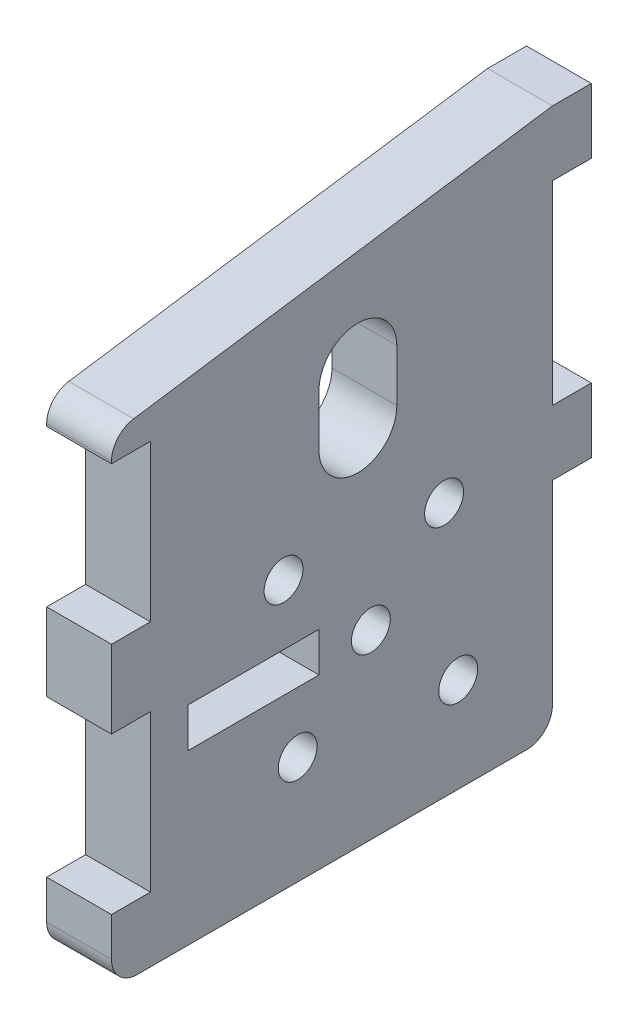
ISO-10303-21;
HEADER;
FILE_DESCRIPTION(('STEP AP214'),'2;1');
FILE_NAME('part.step','',(''),(''),'','','');
FILE_SCHEMA(('AUTOMOTIVE_DESIGN { 1 0 10303 214 1 1 1 1 }'));
ENDSEC;
DATA;
#1=APPLICATION_CONTEXT('core data for automotive mechanical design processes');
#2=APPLICATION_PROTOCOL_DEFINITION('international standard','automotive_design',2000,#1);
#3=PRODUCT_CONTEXT('',#1,'mechanical');
#4=PRODUCT('Part','Part','',(#3));
#5=PRODUCT_RELATED_PRODUCT_CATEGORY('part','',(#4));
#6=PRODUCT_DEFINITION_FORMATION('','',#4);
#7=PRODUCT_DEFINITION_CONTEXT('part definition',#1,'design');
#8=PRODUCT_DEFINITION('design','',#6,#7);
#9=PRODUCT_DEFINITION_SHAPE('','',#8);
#10=(LENGTH_UNIT() NAMED_UNIT(*) SI_UNIT(.MILLI.,.METRE.));
#11=(NAMED_UNIT(*) PLANE_ANGLE_UNIT() SI_UNIT($,.RADIAN.));
#12=(NAMED_UNIT(*) SI_UNIT($,.STERADIAN.) SOLID_ANGLE_UNIT());
#13=UNCERTAINTY_MEASURE_WITH_UNIT(LENGTH_MEASURE(1.E-05),#10,'distance_accuracy_value','');
#14=(GEOMETRIC_REPRESENTATION_CONTEXT(3) GLOBAL_UNCERTAINTY_ASSIGNED_CONTEXT((#13)) GLOBAL_UNIT_ASSIGNED_CONTEXT((#10,
#11,#12)) REPRESENTATION_CONTEXT('',''));
#15=CARTESIAN_POINT('',(0.,0.,0.));
#16=DIRECTION('',(0.,0.,1.));
#17=DIRECTION('',(1.,0.,0.));
#18=AXIS2_PLACEMENT_3D('',#15,#16,#17);
#19=CARTESIAN_POINT('',(5.,23.,20.));
#20=DIRECTION('',(0.,0.,-1.));
#21=DIRECTION('',(0.,1.,0.));
#22=AXIS2_PLACEMENT_3D('',#19,#20,#21);
#23=PLANE('',#22);
#24=DIRECTION('',(0.,-1.,0.));
#25=VECTOR('',#24,1.);
#26=CARTESIAN_POINT('',(0.,23.,20.));
#27=LINE('',#26,#25);
#28=CARTESIAN_POINT('',(0.,-9.00000000000001,20.));
#29=VERTEX_POINT('',#28);
#30=CARTESIAN_POINT('',(0.,-12.,20.));
#31=VERTEX_POINT('',#30);
#32=EDGE_CURVE('E411',#29,#31,#27,.T.);
#33=ORIENTED_EDGE('',*,*,#32,.T.);
#34=DIRECTION('',(-1.,0.,0.));
#35=VECTOR('',#34,1.);
#36=CARTESIAN_POINT('',(5.,-12.,20.));
#37=LINE('',#36,#35);
#38=CARTESIAN_POINT('',(5.,-12.,20.));
#39=VERTEX_POINT('',#38);
#40=EDGE_CURVE('E11',#31,#39,#37,.F.);
#41=ORIENTED_EDGE('',*,*,#40,.T.);
#42=DIRECTION('',(0.,-1.,0.));
#43=VECTOR('',#42,1.);
#44=CARTESIAN_POINT('',(5.,23.,20.));
#45=LINE('',#44,#43);
#46=CARTESIAN_POINT('',(5.,-9.00000000000001,20.));
#47=VERTEX_POINT('',#46);
#48=EDGE_CURVE('E385',#47,#39,#45,.T.);
#49=ORIENTED_EDGE('',*,*,#48,.F.);
#50=DIRECTION('',(1.,0.,0.));
#51=VECTOR('',#50,1.);
#52=CARTESIAN_POINT('',(0.,-9.00000000000001,20.));
#53=LINE('',#52,#51);
#54=EDGE_CURVE('E284',#29,#47,#53,.T.);
#55=ORIENTED_EDGE('',*,*,#54,.F.);
#56=EDGE_LOOP('',(#33,#41,#49,#55));
#57=FACE_BOUND('',#56,.T.);
#58=ADVANCED_FACE('F33',(#57),#23,.F.);
#59=CARTESIAN_POINT('',(5.,21.2726070261836,20.));
#60=VERTEX_POINT('',#59);
#61=CARTESIAN_POINT('',(5.,21.1,20.));
#62=VERTEX_POINT('',#61);
#63=EDGE_CURVE('E386',#60,#62,#45,.T.);
#64=ORIENTED_EDGE('',*,*,#63,.F.);
#65=DIRECTION('',(-1.,0.,0.));
#66=VECTOR('',#65,1.);
#67=CARTESIAN_POINT('',(5.,21.2726070261836,20.));
#68=LINE('',#67,#66);
#69=CARTESIAN_POINT('',(0.,21.2726070261836,20.));
#70=VERTEX_POINT('',#69);
#71=EDGE_CURVE('E482',#60,#70,#68,.T.);
#72=ORIENTED_EDGE('',*,*,#71,.T.);
#73=CARTESIAN_POINT('',(0.,21.1,20.));
#74=VERTEX_POINT('',#73);
#75=EDGE_CURVE('E412',#70,#74,#27,.T.);
#76=ORIENTED_EDGE('',*,*,#75,.T.);
#77=DIRECTION('',(1.,0.,0.));
#78=VECTOR('',#77,1.);
#79=CARTESIAN_POINT('',(0.,21.1,20.));
#80=LINE('',#79,#78);
#81=EDGE_CURVE('E308',#74,#62,#80,.T.);
#82=ORIENTED_EDGE('',*,*,#81,.T.);
#83=EDGE_LOOP('',(#64,#72,#76,#82));
#84=FACE_BOUND('',#83,.T.);
#85=ADVANCED_FACE('F487',(#84),#23,.F.);
#86=CARTESIAN_POINT('',(5.,0.,0.));
#87=DIRECTION('',(1.,0.,0.));
#88=DIRECTION('',(0.,0.,-1.));
#89=AXIS2_PLACEMENT_3D('',#86,#87,#88);
#90=PLANE('',#89);
#91=CARTESIAN_POINT('',(5.,18.,1.));
#92=DIRECTION('',(1.,0.,0.));
#93=DIRECTION('',(0.,0.,1.));
#94=AXIS2_PLACEMENT_3D('',#91,#92,#93);
#95=CIRCLE('',#94,3.);
#96=CARTESIAN_POINT('',(5.,18.,-2.));
#97=VERTEX_POINT('',#96);
#98=CARTESIAN_POINT('',(5.,18.,4.));
#99=VERTEX_POINT('',#98);
#100=EDGE_CURVE('E250',#97,#99,#95,.T.);
#101=ORIENTED_EDGE('',*,*,#100,.F.);
#102=DIRECTION('',(0.,1.,0.));
#103=VECTOR('',#102,1.);
#104=CARTESIAN_POINT('',(5.,18.,-2.));
#105=LINE('',#104,#103);
#106=CARTESIAN_POINT('',(5.,14.,-2.));
#107=VERTEX_POINT('',#106);
#108=EDGE_CURVE('E254',#107,#97,#105,.T.);
#109=ORIENTED_EDGE('',*,*,#108,.F.);
#110=CARTESIAN_POINT('',(5.,14.,1.));
#111=DIRECTION('',(1.,0.,0.));
#112=DIRECTION('',(0.,0.,-1.));
#113=AXIS2_PLACEMENT_3D('',#110,#111,#112);
#114=CIRCLE('',#113,3.);
#115=CARTESIAN_POINT('',(5.,14.,4.));
#116=VERTEX_POINT('',#115);
#117=EDGE_CURVE('E234',#116,#107,#114,.T.);
#118=ORIENTED_EDGE('',*,*,#117,.F.);
#119=DIRECTION('',(0.,-1.,0.));
#120=VECTOR('',#119,1.);
#121=CARTESIAN_POINT('',(5.,18.,4.));
#122=LINE('',#121,#120);
#123=EDGE_CURVE('E245',#99,#116,#122,.T.);
#124=ORIENTED_EDGE('',*,*,#123,.F.);
#125=EDGE_LOOP('',(#101,#109,#118,#124));
#126=FACE_BOUND('',#125,.T.);
#127=DIRECTION('',(0.,0.,-1.));
#128=VECTOR('',#127,1.);
#129=CARTESIAN_POINT('',(5.,-14.,-14.));
#130=LINE('',#129,#128);
#131=CARTESIAN_POINT('',(5.,-14.,18.));
#132=VERTEX_POINT('',#131);
#133=CARTESIAN_POINT('',(5.,-14.,-12.));
#134=VERTEX_POINT('',#133);
#135=EDGE_CURVE('E388',#132,#134,#130,.T.);
#136=ORIENTED_EDGE('',*,*,#135,.T.);
#137=CARTESIAN_POINT('',(5.,-12.,-12.));
#138=DIRECTION('',(1.,0.,0.));
#139=DIRECTION('',(0.,0.,-1.));
#140=AXIS2_PLACEMENT_3D('',#137,#138,#139);
#141=CIRCLE('',#140,2.);
#142=CARTESIAN_POINT('',(5.,-12.,-14.));
#143=VERTEX_POINT('',#142);
#144=EDGE_CURVE('E480',#134,#143,#141,.T.);
#145=ORIENTED_EDGE('',*,*,#144,.T.);
#146=DIRECTION('',(0.,1.,0.));
#147=VECTOR('',#146,1.);
#148=CARTESIAN_POINT('',(5.,3.,-14.));
#149=LINE('',#148,#147);
#150=CARTESIAN_POINT('',(5.,3.,-14.));
#151=VERTEX_POINT('',#150);
#152=EDGE_CURVE('E392',#143,#151,#149,.T.);
#153=ORIENTED_EDGE('',*,*,#152,.T.);
#154=DIRECTION('',(0.,0.,-1.));
#155=VECTOR('',#154,1.);
#156=CARTESIAN_POINT('',(5.,3.,-17.));
#157=LINE('',#156,#155);
#158=CARTESIAN_POINT('',(5.,3.,-17.));
#159=VERTEX_POINT('',#158);
#160=EDGE_CURVE('E394',#151,#159,#157,.T.);
#161=ORIENTED_EDGE('',*,*,#160,.T.);
#162=DIRECTION('',(0.,1.,0.));
#163=VECTOR('',#162,1.);
#164=CARTESIAN_POINT('',(5.,8.00000000000001,-17.));
#165=LINE('',#164,#163);
#166=CARTESIAN_POINT('',(5.,8.00000000000001,-17.));
#167=VERTEX_POINT('',#166);
#168=EDGE_CURVE('E396',#159,#167,#165,.T.);
#169=ORIENTED_EDGE('',*,*,#168,.T.);
#170=DIRECTION('',(0.,0.,1.));
#171=VECTOR('',#170,1.);
#172=CARTESIAN_POINT('',(5.,8.00000000000001,-14.));
#173=LINE('',#172,#171);
#174=CARTESIAN_POINT('',(5.,8.00000000000001,-14.));
#175=VERTEX_POINT('',#174);
#176=EDGE_CURVE('E398',#167,#175,#173,.T.);
#177=ORIENTED_EDGE('',*,*,#176,.T.);
#178=DIRECTION('',(0.,1.,0.));
#179=VECTOR('',#178,1.);
#180=CARTESIAN_POINT('',(5.,23.,-14.));
#181=LINE('',#180,#179);
#182=CARTESIAN_POINT('',(5.,23.,-14.));
#183=VERTEX_POINT('',#182);
#184=EDGE_CURVE('E400',#175,#183,#181,.T.);
#185=ORIENTED_EDGE('',*,*,#184,.T.);
#186=DIRECTION('',(0.,0.,-1.));
#187=VECTOR('',#186,1.);
#188=CARTESIAN_POINT('',(5.,23.,-17.));
#189=LINE('',#188,#187);
#190=CARTESIAN_POINT('',(5.,23.,-17.));
#191=VERTEX_POINT('',#190);
#192=EDGE_CURVE('E402',#183,#191,#189,.T.);
#193=ORIENTED_EDGE('',*,*,#192,.T.);
#194=DIRECTION('',(0.,1.,0.));
#195=VECTOR('',#194,1.);
#196=CARTESIAN_POINT('',(5.,28.,-17.));
#197=LINE('',#196,#195);
#198=CARTESIAN_POINT('',(5.,28.,-17.));
#199=VERTEX_POINT('',#198);
#200=EDGE_CURVE('E404',#191,#199,#197,.T.);
#201=ORIENTED_EDGE('',*,*,#200,.T.);
#202=DIRECTION('',(0.,0.,1.));
#203=VECTOR('',#202,1.);
#204=CARTESIAN_POINT('',(5.,28.,-17.));
#205=LINE('',#204,#203);
#206=CARTESIAN_POINT('',(5.,28.,-14.));
#207=VERTEX_POINT('',#206);
#208=EDGE_CURVE('E379',#199,#207,#205,.T.);
#209=ORIENTED_EDGE('',*,*,#208,.T.);
#210=DIRECTION('',(0.,-0.145493990494831,0.989359135364853));
#211=VECTOR('',#210,1.);
#212=CARTESIAN_POINT('',(5.,28.,-14.));
#213=LINE('',#212,#211);
#214=CARTESIAN_POINT('',(5.,23.2513252969133,18.2909879809897));
#215=VERTEX_POINT('',#214);
#216=EDGE_CURVE('E382',#207,#215,#213,.T.);
#217=ORIENTED_EDGE('',*,*,#216,.T.);
#218=CARTESIAN_POINT('',(5.,21.2726070261836,18.));
#219=DIRECTION('',(1.,0.,0.));
#220=DIRECTION('',(0.,0.,-1.));
#221=AXIS2_PLACEMENT_3D('',#218,#219,#220);
#222=CIRCLE('',#221,2.);
#223=EDGE_CURVE('E48',#215,#60,#222,.T.);
#224=ORIENTED_EDGE('',*,*,#223,.T.);
#225=ORIENTED_EDGE('',*,*,#63,.T.);
#226=DIRECTION('',(0.,0.,1.));
#227=VECTOR('',#226,1.);
#228=CARTESIAN_POINT('',(5.,21.1,20.));
#229=LINE('',#228,#227);
#230=CARTESIAN_POINT('',(5.,21.1,17.));
#231=VERTEX_POINT('',#230);
#232=EDGE_CURVE('E294',#231,#62,#229,.T.);
#233=ORIENTED_EDGE('',*,*,#232,.F.);
#234=DIRECTION('',(0.,1.,0.));
#235=VECTOR('',#234,1.);
#236=CARTESIAN_POINT('',(5.,21.1,17.));
#237=LINE('',#236,#235);
#238=CARTESIAN_POINT('',(5.,9.04999999999999,17.));
#239=VERTEX_POINT('',#238);
#240=EDGE_CURVE('E303',#239,#231,#237,.T.);
#241=ORIENTED_EDGE('',*,*,#240,.F.);
#242=DIRECTION('',(0.,0.,-1.));
#243=VECTOR('',#242,1.);
#244=CARTESIAN_POINT('',(5.,9.04999999999999,17.));
#245=LINE('',#244,#243);
#246=CARTESIAN_POINT('',(5.,9.04999999999999,20.));
#247=VERTEX_POINT('',#246);
#248=EDGE_CURVE('E283',#247,#239,#245,.T.);
#249=ORIENTED_EDGE('',*,*,#248,.F.);
#250=CARTESIAN_POINT('',(5.,3.04999999999999,20.));
#251=VERTEX_POINT('',#250);
#252=EDGE_CURVE('E389',#247,#251,#45,.T.);
#253=ORIENTED_EDGE('',*,*,#252,.T.);
#254=DIRECTION('',(0.,0.,1.));
#255=VECTOR('',#254,1.);
#256=CARTESIAN_POINT('',(5.,3.04999999999999,17.));
#257=LINE('',#256,#255);
#258=CARTESIAN_POINT('',(5.,3.04999999999999,17.));
#259=VERTEX_POINT('',#258);
#260=EDGE_CURVE('E277',#259,#251,#257,.T.);
#261=ORIENTED_EDGE('',*,*,#260,.F.);
#262=DIRECTION('',(0.,1.,0.));
#263=VECTOR('',#262,1.);
#264=CARTESIAN_POINT('',(5.,-9.00000000000001,17.));
#265=LINE('',#264,#263);
#266=CARTESIAN_POINT('',(5.,-9.00000000000001,17.));
#267=VERTEX_POINT('',#266);
#268=EDGE_CURVE('E261',#267,#259,#265,.T.);
#269=ORIENTED_EDGE('',*,*,#268,.F.);
#270=DIRECTION('',(0.,0.,-1.));
#271=VECTOR('',#270,1.);
#272=CARTESIAN_POINT('',(5.,-9.00000000000001,17.));
#273=LINE('',#272,#271);
#274=EDGE_CURVE('E268',#47,#267,#273,.T.);
#275=ORIENTED_EDGE('',*,*,#274,.F.);
#276=ORIENTED_EDGE('',*,*,#48,.T.);
#277=CARTESIAN_POINT('',(5.,-12.,18.));
#278=DIRECTION('',(1.,0.,0.));
#279=DIRECTION('',(0.,0.,-1.));
#280=AXIS2_PLACEMENT_3D('',#277,#278,#279);
#281=CIRCLE('',#280,2.);
#282=EDGE_CURVE('E477',#39,#132,#281,.T.);
#283=ORIENTED_EDGE('',*,*,#282,.T.);
#284=EDGE_LOOP('',(#136,#145,#153,#161,#169,#177,#185,#193,#201,#209,#217,#224,#225,#233,#241,
#249,#253,#261,#269,#275,#276,#283));
#285=FACE_BOUND('',#284,.T.);
#286=DIRECTION('',(0.,-1.,0.));
#287=VECTOR('',#286,1.);
#288=CARTESIAN_POINT('',(5.,2.04999999999999,14.1));
#289=LINE('',#288,#287);
#290=CARTESIAN_POINT('',(5.,2.04999999999999,14.1));
#291=VERTEX_POINT('',#290);
#292=CARTESIAN_POINT('',(5.,-1.00000000000001,14.1));
#293=VERTEX_POINT('',#292);
#294=EDGE_CURVE('E311',#291,#293,#289,.T.);
#295=ORIENTED_EDGE('',*,*,#294,.F.);
#296=DIRECTION('',(0.,0.,1.));
#297=VECTOR('',#296,1.);
#298=CARTESIAN_POINT('',(5.,2.04999999999999,14.1));
#299=LINE('',#298,#297);
#300=CARTESIAN_POINT('',(5.,2.04999999999999,4.));
#301=VERTEX_POINT('',#300);
#302=EDGE_CURVE('E321',#301,#291,#299,.T.);
#303=ORIENTED_EDGE('',*,*,#302,.F.);
#304=DIRECTION('',(0.,1.,0.));
#305=VECTOR('',#304,1.);
#306=CARTESIAN_POINT('',(5.,2.04999999999999,4.));
#307=LINE('',#306,#305);
#308=CARTESIAN_POINT('',(5.,-1.00000000000001,4.));
#309=VERTEX_POINT('',#308);
#310=EDGE_CURVE('E335',#309,#301,#307,.T.);
#311=ORIENTED_EDGE('',*,*,#310,.F.);
#312=DIRECTION('',(0.,0.,-1.));
#313=VECTOR('',#312,1.);
#314=CARTESIAN_POINT('',(5.,-1.00000000000001,14.1));
#315=LINE('',#314,#313);
#316=EDGE_CURVE('E332',#293,#309,#315,.T.);
#317=ORIENTED_EDGE('',*,*,#316,.F.);
#318=EDGE_LOOP('',(#295,#303,#311,#317));
#319=FACE_BOUND('',#318,.T.);
#320=CARTESIAN_POINT('',(5.,5.6706325597985,-5.64304229753299));
#321=DIRECTION('',(1.,0.,0.));
#322=DIRECTION('',(0.,0.,-1.));
#323=AXIS2_PLACEMENT_3D('',#320,#321,#322);
#324=CIRCLE('',#323,1.5);
#325=CARTESIAN_POINT('',(5.,5.6706325597985,-7.14304229753299));
#326=VERTEX_POINT('',#325);
#327=EDGE_CURVE('E355',#326,#326,#324,.T.);
#328=ORIENTED_EDGE('',*,*,#327,.F.);
#329=EDGE_LOOP('',(#328));
#330=FACE_BOUND('',#329,.T.);
#331=CARTESIAN_POINT('',(5.,-5.6706325597985,5.64304229753298));
#332=DIRECTION('',(1.,0.,0.));
#333=DIRECTION('',(0.,0.,-1.));
#334=AXIS2_PLACEMENT_3D('',#331,#332,#333);
#335=CIRCLE('',#334,1.5);
#336=CARTESIAN_POINT('',(5.,-5.6706325597985,4.14304229753298));
#337=VERTEX_POINT('',#336);
#338=EDGE_CURVE('E367',#337,#337,#335,.T.);
#339=ORIENTED_EDGE('',*,*,#338,.F.);
#340=EDGE_LOOP('',(#339));
#341=FACE_BOUND('',#340,.T.);
#342=CARTESIAN_POINT('',(5.,6.70111272832109,6.73387616476139));
#343=DIRECTION('',(1.,0.,0.));
#344=DIRECTION('',(0.,0.,-1.));
#345=AXIS2_PLACEMENT_3D('',#342,#343,#344);
#346=CIRCLE('',#345,1.5);
#347=CARTESIAN_POINT('',(5.,6.70111272832109,5.23387616476139));
#348=VERTEX_POINT('',#347);
#349=EDGE_CURVE('E373',#348,#348,#346,.T.);
#350=ORIENTED_EDGE('',*,*,#349,.F.);
#351=EDGE_LOOP('',(#350));
#352=FACE_BOUND('',#351,.T.);
#353=CARTESIAN_POINT('',(5.,-6.70111272832109,-6.7338761647614));
#354=DIRECTION('',(1.,0.,0.));
#355=DIRECTION('',(0.,0.,-1.));
#356=AXIS2_PLACEMENT_3D('',#353,#354,#355);
#357=CIRCLE('',#356,1.5);
#358=CARTESIAN_POINT('',(5.,-6.70111272832109,-8.2338761647614));
#359=VERTEX_POINT('',#358);
#360=EDGE_CURVE('E361',#359,#359,#357,.T.);
#361=ORIENTED_EDGE('',*,*,#360,.F.);
#362=EDGE_LOOP('',(#361));
#363=FACE_BOUND('',#362,.T.);
#364=CARTESIAN_POINT('',(5.,0.,0.));
#365=DIRECTION('',(1.,0.,0.));
#366=DIRECTION('',(0.,0.,-1.));
#367=AXIS2_PLACEMENT_3D('',#364,#365,#366);
#368=CIRCLE('',#367,1.5);
#369=CARTESIAN_POINT('',(5.,0.,-1.5));
#370=VERTEX_POINT('',#369);
#371=EDGE_CURVE('E349',#370,#370,#368,.T.);
#372=ORIENTED_EDGE('',*,*,#371,.F.);
#373=EDGE_LOOP('',(#372));
#374=FACE_BOUND('',#373,.T.);
#375=ADVANCED_FACE('F252',(#126,#285,#319,#330,#341,#352,#363,#374),#90,.T.);
#376=CARTESIAN_POINT('',(0.,0.,0.));
#377=DIRECTION('',(1.,0.,0.));
#378=DIRECTION('',(0.,0.,-1.));
#379=AXIS2_PLACEMENT_3D('',#376,#377,#378);
#380=PLANE('',#379);
#381=DIRECTION('',(0.,1.,0.));
#382=VECTOR('',#381,1.);
#383=CARTESIAN_POINT('',(0.,0.,-2.));
#384=LINE('',#383,#382);
#385=CARTESIAN_POINT('',(0.,14.,-2.));
#386=VERTEX_POINT('',#385);
#387=CARTESIAN_POINT('',(0.,18.,-2.));
#388=VERTEX_POINT('',#387);
#389=EDGE_CURVE('E457',#386,#388,#384,.T.);
#390=ORIENTED_EDGE('',*,*,#389,.T.);
#391=CARTESIAN_POINT('',(0.,18.,1.));
#392=DIRECTION('',(1.,0.,0.));
#393=DIRECTION('',(0.,0.,-1.));
#394=AXIS2_PLACEMENT_3D('',#391,#392,#393);
#395=CIRCLE('',#394,3.);
#396=CARTESIAN_POINT('',(0.,18.,4.));
#397=VERTEX_POINT('',#396);
#398=EDGE_CURVE('E460',#388,#397,#395,.T.);
#399=ORIENTED_EDGE('',*,*,#398,.T.);
#400=DIRECTION('',(0.,-1.,0.));
#401=VECTOR('',#400,1.);
#402=CARTESIAN_POINT('',(0.,0.,4.));
#403=LINE('',#402,#401);
#404=CARTESIAN_POINT('',(0.,14.,4.));
#405=VERTEX_POINT('',#404);
#406=EDGE_CURVE('E454',#397,#405,#403,.T.);
#407=ORIENTED_EDGE('',*,*,#406,.T.);
#408=CARTESIAN_POINT('',(0.,14.,1.));
#409=DIRECTION('',(1.,0.,0.));
#410=DIRECTION('',(0.,0.,-1.));
#411=AXIS2_PLACEMENT_3D('',#408,#409,#410);
#412=CIRCLE('',#411,3.);
#413=EDGE_CURVE('E237',#405,#386,#412,.T.);
#414=ORIENTED_EDGE('',*,*,#413,.T.);
#415=EDGE_LOOP('',(#390,#399,#407,#414));
#416=FACE_BOUND('',#415,.T.);
#417=DIRECTION('',(0.,0.,1.));
#418=VECTOR('',#417,1.);
#419=CARTESIAN_POINT('',(0.,2.04999999999999,14.1));
#420=LINE('',#419,#418);
#421=CARTESIAN_POINT('',(0.,2.04999999999999,4.));
#422=VERTEX_POINT('',#421);
#423=CARTESIAN_POINT('',(0.,2.04999999999999,14.1));
#424=VERTEX_POINT('',#423);
#425=EDGE_CURVE('E327',#422,#424,#420,.T.);
#426=ORIENTED_EDGE('',*,*,#425,.T.);
#427=DIRECTION('',(0.,-1.,0.));
#428=VECTOR('',#427,1.);
#429=CARTESIAN_POINT('',(0.,2.04999999999999,14.1));
#430=LINE('',#429,#428);
#431=CARTESIAN_POINT('',(0.,-1.00000000000001,14.1));
#432=VERTEX_POINT('',#431);
#433=EDGE_CURVE('E317',#424,#432,#430,.T.);
#434=ORIENTED_EDGE('',*,*,#433,.T.);
#435=DIRECTION('',(0.,0.,-1.));
#436=VECTOR('',#435,1.);
#437=CARTESIAN_POINT('',(0.,-1.00000000000001,14.1));
#438=LINE('',#437,#436);
#439=CARTESIAN_POINT('',(0.,-1.00000000000001,4.));
#440=VERTEX_POINT('',#439);
#441=EDGE_CURVE('E320',#432,#440,#438,.T.);
#442=ORIENTED_EDGE('',*,*,#441,.T.);
#443=DIRECTION('',(0.,1.,0.));
#444=VECTOR('',#443,1.);
#445=CARTESIAN_POINT('',(0.,2.04999999999999,4.));
#446=LINE('',#445,#444);
#447=EDGE_CURVE('E324',#440,#422,#446,.T.);
#448=ORIENTED_EDGE('',*,*,#447,.T.);
#449=EDGE_LOOP('',(#426,#434,#442,#448));
#450=FACE_BOUND('',#449,.T.);
#451=CARTESIAN_POINT('',(0.,5.6706325597985,-5.64304229753299));
#452=DIRECTION('',(1.,0.,0.));
#453=DIRECTION('',(0.,0.,-1.));
#454=AXIS2_PLACEMENT_3D('',#451,#452,#453);
#455=CIRCLE('',#454,1.5);
#456=CARTESIAN_POINT('',(0.,5.6706325597985,-7.14304229753299));
#457=VERTEX_POINT('',#456);
#458=EDGE_CURVE('E352',#457,#457,#455,.T.);
#459=ORIENTED_EDGE('',*,*,#458,.T.);
#460=EDGE_LOOP('',(#459));
#461=FACE_BOUND('',#460,.T.);
#462=CARTESIAN_POINT('',(0.,-5.6706325597985,5.64304229753298));
#463=DIRECTION('',(1.,0.,0.));
#464=DIRECTION('',(0.,0.,-1.));
#465=AXIS2_PLACEMENT_3D('',#462,#463,#464);
#466=CIRCLE('',#465,1.5);
#467=CARTESIAN_POINT('',(0.,-5.6706325597985,4.14304229753298));
#468=VERTEX_POINT('',#467);
#469=EDGE_CURVE('E364',#468,#468,#466,.T.);
#470=ORIENTED_EDGE('',*,*,#469,.T.);
#471=EDGE_LOOP('',(#470));
#472=FACE_BOUND('',#471,.T.);
#473=DIRECTION('',(0.,1.,0.));
#474=VECTOR('',#473,1.);
#475=CARTESIAN_POINT('',(0.,3.,-14.));
#476=LINE('',#475,#474);
#477=CARTESIAN_POINT('',(0.,-12.,-14.));
#478=VERTEX_POINT('',#477);
#479=CARTESIAN_POINT('',(0.,3.,-14.));
#480=VERTEX_POINT('',#479);
#481=EDGE_CURVE('E418',#478,#480,#476,.T.);
#482=ORIENTED_EDGE('',*,*,#481,.F.);
#483=CARTESIAN_POINT('',(0.,-12.,-12.));
#484=DIRECTION('',(1.,0.,0.));
#485=DIRECTION('',(0.,0.,-1.));
#486=AXIS2_PLACEMENT_3D('',#483,#484,#485);
#487=CIRCLE('',#486,2.);
#488=CARTESIAN_POINT('',(0.,-14.,-12.));
#489=VERTEX_POINT('',#488);
#490=EDGE_CURVE('E470',#478,#489,#487,.F.);
#491=ORIENTED_EDGE('',*,*,#490,.T.);
#492=DIRECTION('',(0.,0.,-1.));
#493=VECTOR('',#492,1.);
#494=CARTESIAN_POINT('',(0.,-14.,-14.));
#495=LINE('',#494,#493);
#496=CARTESIAN_POINT('',(0.,-14.,18.));
#497=VERTEX_POINT('',#496);
#498=EDGE_CURVE('E414',#497,#489,#495,.T.);
#499=ORIENTED_EDGE('',*,*,#498,.F.);
#500=CARTESIAN_POINT('',(0.,-12.,18.));
#501=DIRECTION('',(1.,0.,0.));
#502=DIRECTION('',(0.,0.,-1.));
#503=AXIS2_PLACEMENT_3D('',#500,#501,#502);
#504=CIRCLE('',#503,2.);
#505=EDGE_CURVE('E466',#497,#31,#504,.F.);
#506=ORIENTED_EDGE('',*,*,#505,.T.);
#507=ORIENTED_EDGE('',*,*,#32,.F.);
#508=DIRECTION('',(0.,0.,-1.));
#509=VECTOR('',#508,1.);
#510=CARTESIAN_POINT('',(0.,-9.00000000000001,17.));
#511=LINE('',#510,#509);
#512=CARTESIAN_POINT('',(0.,-9.00000000000001,17.));
#513=VERTEX_POINT('',#512);
#514=EDGE_CURVE('E271',#29,#513,#511,.T.);
#515=ORIENTED_EDGE('',*,*,#514,.T.);
#516=DIRECTION('',(0.,1.,0.));
#517=VECTOR('',#516,1.);
#518=CARTESIAN_POINT('',(0.,-9.00000000000001,17.));
#519=LINE('',#518,#517);
#520=CARTESIAN_POINT('',(0.,3.04999999999999,17.));
#521=VERTEX_POINT('',#520);
#522=EDGE_CURVE('E264',#513,#521,#519,.T.);
#523=ORIENTED_EDGE('',*,*,#522,.T.);
#524=DIRECTION('',(0.,0.,1.));
#525=VECTOR('',#524,1.);
#526=CARTESIAN_POINT('',(0.,3.04999999999999,17.));
#527=LINE('',#526,#525);
#528=CARTESIAN_POINT('',(0.,3.04999999999999,20.));
#529=VERTEX_POINT('',#528);
#530=EDGE_CURVE('E267',#521,#529,#527,.T.);
#531=ORIENTED_EDGE('',*,*,#530,.T.);
#532=CARTESIAN_POINT('',(0.,9.04999999999999,20.));
#533=VERTEX_POINT('',#532);
#534=EDGE_CURVE('E415',#533,#529,#27,.T.);
#535=ORIENTED_EDGE('',*,*,#534,.F.);
#536=DIRECTION('',(0.,0.,-1.));
#537=VECTOR('',#536,1.);
#538=CARTESIAN_POINT('',(0.,9.04999999999999,17.));
#539=LINE('',#538,#537);
#540=CARTESIAN_POINT('',(0.,9.04999999999999,17.));
#541=VERTEX_POINT('',#540);
#542=EDGE_CURVE('E290',#533,#541,#539,.T.);
#543=ORIENTED_EDGE('',*,*,#542,.T.);
#544=DIRECTION('',(0.,1.,0.));
#545=VECTOR('',#544,1.);
#546=CARTESIAN_POINT('',(0.,21.1,17.));
#547=LINE('',#546,#545);
#548=CARTESIAN_POINT('',(0.,21.1,17.));
#549=VERTEX_POINT('',#548);
#550=EDGE_CURVE('E293',#541,#549,#547,.T.);
#551=ORIENTED_EDGE('',*,*,#550,.T.);
#552=DIRECTION('',(0.,0.,1.));
#553=VECTOR('',#552,1.);
#554=CARTESIAN_POINT('',(0.,21.1,20.));
#555=LINE('',#554,#553);
#556=EDGE_CURVE('E297',#549,#74,#555,.T.);
#557=ORIENTED_EDGE('',*,*,#556,.T.);
#558=ORIENTED_EDGE('',*,*,#75,.F.);
#559=CARTESIAN_POINT('',(0.,21.2726070261836,18.));
#560=DIRECTION('',(1.,0.,0.));
#561=DIRECTION('',(0.,0.,-1.));
#562=AXIS2_PLACEMENT_3D('',#559,#560,#561);
#563=CIRCLE('',#562,2.);
#564=CARTESIAN_POINT('',(0.,23.2513252969133,18.2909879809897));
#565=VERTEX_POINT('',#564);
#566=EDGE_CURVE('E468',#70,#565,#563,.F.);
#567=ORIENTED_EDGE('',*,*,#566,.T.);
#568=DIRECTION('',(0.,-0.145493990494831,0.989359135364853));
#569=VECTOR('',#568,1.);
#570=CARTESIAN_POINT('',(0.,28.,-14.));
#571=LINE('',#570,#569);
#572=CARTESIAN_POINT('',(0.,28.,-14.));
#573=VERTEX_POINT('',#572);
#574=EDGE_CURVE('E409',#573,#565,#571,.T.);
#575=ORIENTED_EDGE('',*,*,#574,.F.);
#576=DIRECTION('',(0.,0.,1.));
#577=VECTOR('',#576,1.);
#578=CARTESIAN_POINT('',(0.,28.,-17.));
#579=LINE('',#578,#577);
#580=CARTESIAN_POINT('',(0.,28.,-17.));
#581=VERTEX_POINT('',#580);
#582=EDGE_CURVE('E376',#581,#573,#579,.T.);
#583=ORIENTED_EDGE('',*,*,#582,.F.);
#584=DIRECTION('',(0.,1.,0.));
#585=VECTOR('',#584,1.);
#586=CARTESIAN_POINT('',(0.,28.,-17.));
#587=LINE('',#586,#585);
#588=CARTESIAN_POINT('',(0.,23.,-17.));
#589=VERTEX_POINT('',#588);
#590=EDGE_CURVE('E383',#589,#581,#587,.T.);
#591=ORIENTED_EDGE('',*,*,#590,.F.);
#592=DIRECTION('',(0.,0.,-1.));
#593=VECTOR('',#592,1.);
#594=CARTESIAN_POINT('',(0.,23.,-17.));
#595=LINE('',#594,#593);
#596=CARTESIAN_POINT('',(0.,23.,-14.));
#597=VERTEX_POINT('',#596);
#598=EDGE_CURVE('E428',#597,#589,#595,.T.);
#599=ORIENTED_EDGE('',*,*,#598,.F.);
#600=DIRECTION('',(0.,1.,0.));
#601=VECTOR('',#600,1.);
#602=CARTESIAN_POINT('',(0.,23.,-14.));
#603=LINE('',#602,#601);
#604=CARTESIAN_POINT('',(0.,8.00000000000001,-14.));
#605=VERTEX_POINT('',#604);
#606=EDGE_CURVE('E426',#605,#597,#603,.T.);
#607=ORIENTED_EDGE('',*,*,#606,.F.);
#608=DIRECTION('',(0.,0.,1.));
#609=VECTOR('',#608,1.);
#610=CARTESIAN_POINT('',(0.,8.00000000000001,-14.));
#611=LINE('',#610,#609);
#612=CARTESIAN_POINT('',(0.,8.00000000000001,-17.));
#613=VERTEX_POINT('',#612);
#614=EDGE_CURVE('E424',#613,#605,#611,.T.);
#615=ORIENTED_EDGE('',*,*,#614,.F.);
#616=DIRECTION('',(0.,1.,0.));
#617=VECTOR('',#616,1.);
#618=CARTESIAN_POINT('',(0.,8.00000000000001,-17.));
#619=LINE('',#618,#617);
#620=CARTESIAN_POINT('',(0.,3.,-17.));
#621=VERTEX_POINT('',#620);
#622=EDGE_CURVE('E422',#621,#613,#619,.T.);
#623=ORIENTED_EDGE('',*,*,#622,.F.);
#624=DIRECTION('',(0.,0.,-1.));
#625=VECTOR('',#624,1.);
#626=CARTESIAN_POINT('',(0.,3.,-17.));
#627=LINE('',#626,#625);
#628=EDGE_CURVE('E420',#480,#621,#627,.T.);
#629=ORIENTED_EDGE('',*,*,#628,.F.);
#630=EDGE_LOOP('',(#482,#491,#499,#506,#507,#515,#523,#531,#535,#543,#551,#557,#558,#567,#575,
#583,#591,#599,#607,#615,#623,#629));
#631=FACE_BOUND('',#630,.T.);
#632=CARTESIAN_POINT('',(0.,6.70111272832109,6.73387616476139));
#633=DIRECTION('',(1.,0.,0.));
#634=DIRECTION('',(0.,0.,-1.));
#635=AXIS2_PLACEMENT_3D('',#632,#633,#634);
#636=CIRCLE('',#635,1.5);
#637=CARTESIAN_POINT('',(0.,6.70111272832109,5.23387616476139));
#638=VERTEX_POINT('',#637);
#639=EDGE_CURVE('E370',#638,#638,#636,.T.);
#640=ORIENTED_EDGE('',*,*,#639,.T.);
#641=EDGE_LOOP('',(#640));
#642=FACE_BOUND('',#641,.T.);
#643=CARTESIAN_POINT('',(0.,-6.70111272832109,-6.7338761647614));
#644=DIRECTION('',(1.,0.,0.));
#645=DIRECTION('',(0.,0.,-1.));
#646=AXIS2_PLACEMENT_3D('',#643,#644,#645);
#647=CIRCLE('',#646,1.5);
#648=CARTESIAN_POINT('',(0.,-6.70111272832109,-8.2338761647614));
#649=VERTEX_POINT('',#648);
#650=EDGE_CURVE('E358',#649,#649,#647,.T.);
#651=ORIENTED_EDGE('',*,*,#650,.T.);
#652=EDGE_LOOP('',(#651));
#653=FACE_BOUND('',#652,.T.);
#654=CARTESIAN_POINT('',(0.,0.,0.));
#655=DIRECTION('',(1.,0.,0.));
#656=DIRECTION('',(0.,0.,-1.));
#657=AXIS2_PLACEMENT_3D('',#654,#655,#656);
#658=CIRCLE('',#657,1.5);
#659=CARTESIAN_POINT('',(0.,0.,-1.5));
#660=VERTEX_POINT('',#659);
#661=EDGE_CURVE('E342',#660,#660,#658,.T.);
#662=ORIENTED_EDGE('',*,*,#661,.T.);
#663=EDGE_LOOP('',(#662));
#664=FACE_BOUND('',#663,.T.);
#665=ADVANCED_FACE('F492',(#416,#450,#461,#472,#631,#642,#653,#664),#380,.F.);
#666=CARTESIAN_POINT('',(5.,28.,-17.));
#667=DIRECTION('',(0.,-1.,0.));
#668=DIRECTION('',(0.,0.,-1.));
#669=AXIS2_PLACEMENT_3D('',#666,#667,#668);
#670=PLANE('',#669);
#671=ORIENTED_EDGE('',*,*,#582,.T.);
#672=DIRECTION('',(-1.,0.,0.));
#673=VECTOR('',#672,1.);
#674=CARTESIAN_POINT('',(5.,28.,-14.));
#675=LINE('',#674,#673);
#676=EDGE_CURVE('E451',#207,#573,#675,.T.);
#677=ORIENTED_EDGE('',*,*,#676,.F.);
#678=ORIENTED_EDGE('',*,*,#208,.F.);
#679=DIRECTION('',(-1.,0.,0.));
#680=VECTOR('',#679,1.);
#681=CARTESIAN_POINT('',(5.,28.,-17.));
#682=LINE('',#681,#680);
#683=EDGE_CURVE('E406',#199,#581,#682,.T.);
#684=ORIENTED_EDGE('',*,*,#683,.T.);
#685=EDGE_LOOP('',(#671,#677,#678,#684));
#686=FACE_BOUND('',#685,.T.);
#687=ADVANCED_FACE('F572',(#686),#670,.F.);
#688=CARTESIAN_POINT('',(5.,28.,-14.));
#689=DIRECTION('',(0.,-0.989359135364853,-0.145493990494831));
#690=DIRECTION('',(0.,0.145493990494831,-0.989359135364853));
#691=AXIS2_PLACEMENT_3D('',#688,#689,#690);
#692=PLANE('',#691);
#693=ORIENTED_EDGE('',*,*,#574,.T.);
#694=DIRECTION('',(-1.,0.,0.));
#695=VECTOR('',#694,1.);
#696=CARTESIAN_POINT('',(5.,23.2513252969133,18.2909879809897));
#697=LINE('',#696,#695);
#698=EDGE_CURVE('E41',#565,#215,#697,.F.);
#699=ORIENTED_EDGE('',*,*,#698,.T.);
#700=ORIENTED_EDGE('',*,*,#216,.F.);
#701=ORIENTED_EDGE('',*,*,#676,.T.);
#702=EDGE_LOOP('',(#693,#699,#700,#701));
#703=FACE_BOUND('',#702,.T.);
#704=ADVANCED_FACE('F588',(#703),#692,.F.);
#705=ORIENTED_EDGE('',*,*,#534,.T.);
#706=DIRECTION('',(1.,0.,0.));
#707=VECTOR('',#706,1.);
#708=CARTESIAN_POINT('',(0.,3.04999999999999,20.));
#709=LINE('',#708,#707);
#710=EDGE_CURVE('E286',#529,#251,#709,.T.);
#711=ORIENTED_EDGE('',*,*,#710,.T.);
#712=ORIENTED_EDGE('',*,*,#252,.F.);
#713=DIRECTION('',(1.,0.,0.));
#714=VECTOR('',#713,1.);
#715=CARTESIAN_POINT('',(0.,9.04999999999999,20.));
#716=LINE('',#715,#714);
#717=EDGE_CURVE('E300',#533,#247,#716,.T.);
#718=ORIENTED_EDGE('',*,*,#717,.F.);
#719=EDGE_LOOP('',(#705,#711,#712,#718));
#720=FACE_BOUND('',#719,.T.);
#721=ADVANCED_FACE('F512',(#720),#23,.F.);
#722=CARTESIAN_POINT('',(5.,-14.,-14.));
#723=DIRECTION('',(0.,1.,0.));
#724=DIRECTION('',(0.,0.,1.));
#725=AXIS2_PLACEMENT_3D('',#722,#723,#724);
#726=PLANE('',#725);
#727=ORIENTED_EDGE('',*,*,#498,.T.);
#728=DIRECTION('',(-1.,0.,0.));
#729=VECTOR('',#728,1.);
#730=CARTESIAN_POINT('',(5.,-14.,-12.));
#731=LINE('',#730,#729);
#732=EDGE_CURVE('E475',#489,#134,#731,.F.);
#733=ORIENTED_EDGE('',*,*,#732,.T.);
#734=ORIENTED_EDGE('',*,*,#135,.F.);
#735=DIRECTION('',(-1.,0.,0.));
#736=VECTOR('',#735,1.);
#737=CARTESIAN_POINT('',(5.,-14.,18.));
#738=LINE('',#737,#736);
#739=EDGE_CURVE('E472',#132,#497,#738,.T.);
#740=ORIENTED_EDGE('',*,*,#739,.T.);
#741=EDGE_LOOP('',(#727,#733,#734,#740));
#742=FACE_BOUND('',#741,.T.);
#743=ADVANCED_FACE('F528',(#742),#726,.F.);
#744=CARTESIAN_POINT('',(5.,3.,-14.));
#745=DIRECTION('',(0.,0.,1.));
#746=DIRECTION('',(1.,0.,0.));
#747=AXIS2_PLACEMENT_3D('',#744,#745,#746);
#748=PLANE('',#747);
#749=ORIENTED_EDGE('',*,*,#152,.F.);
#750=DIRECTION('',(-1.,0.,0.));
#751=VECTOR('',#750,1.);
#752=CARTESIAN_POINT('',(5.,-12.,-14.));
#753=LINE('',#752,#751);
#754=EDGE_CURVE('E463',#143,#478,#753,.T.);
#755=ORIENTED_EDGE('',*,*,#754,.T.);
#756=ORIENTED_EDGE('',*,*,#481,.T.);
#757=DIRECTION('',(-1.,0.,0.));
#758=VECTOR('',#757,1.);
#759=CARTESIAN_POINT('',(5.,3.,-14.));
#760=LINE('',#759,#758);
#761=EDGE_CURVE('E448',#151,#480,#760,.T.);
#762=ORIENTED_EDGE('',*,*,#761,.F.);
#763=EDGE_LOOP('',(#749,#755,#756,#762));
#764=FACE_BOUND('',#763,.T.);
#765=ADVANCED_FACE('F537',(#764),#748,.F.);
#766=CARTESIAN_POINT('',(5.,3.,-17.));
#767=DIRECTION('',(0.,1.,0.));
#768=DIRECTION('',(0.,0.,1.));
#769=AXIS2_PLACEMENT_3D('',#766,#767,#768);
#770=PLANE('',#769);
#771=ORIENTED_EDGE('',*,*,#628,.T.);
#772=DIRECTION('',(-1.,0.,0.));
#773=VECTOR('',#772,1.);
#774=CARTESIAN_POINT('',(5.,3.,-17.));
#775=LINE('',#774,#773);
#776=EDGE_CURVE('E445',#159,#621,#775,.T.);
#777=ORIENTED_EDGE('',*,*,#776,.F.);
#778=ORIENTED_EDGE('',*,*,#160,.F.);
#779=ORIENTED_EDGE('',*,*,#761,.T.);
#780=EDGE_LOOP('',(#771,#777,#778,#779));
#781=FACE_BOUND('',#780,.T.);
#782=ADVANCED_FACE('F542',(#781),#770,.F.);
#783=CARTESIAN_POINT('',(5.,8.00000000000001,-17.));
#784=DIRECTION('',(0.,0.,1.));
#785=DIRECTION('',(1.,0.,0.));
#786=AXIS2_PLACEMENT_3D('',#783,#784,#785);
#787=PLANE('',#786);
#788=ORIENTED_EDGE('',*,*,#622,.T.);
#789=DIRECTION('',(-1.,0.,0.));
#790=VECTOR('',#789,1.);
#791=CARTESIAN_POINT('',(5.,8.00000000000001,-17.));
#792=LINE('',#791,#790);
#793=EDGE_CURVE('E442',#167,#613,#792,.T.);
#794=ORIENTED_EDGE('',*,*,#793,.F.);
#795=ORIENTED_EDGE('',*,*,#168,.F.);
#796=ORIENTED_EDGE('',*,*,#776,.T.);
#797=EDGE_LOOP('',(#788,#794,#795,#796));
#798=FACE_BOUND('',#797,.T.);
#799=ADVANCED_FACE('F548',(#798),#787,.F.);
#800=CARTESIAN_POINT('',(5.,8.00000000000001,-14.));
#801=DIRECTION('',(0.,-1.,0.));
#802=DIRECTION('',(0.,0.,-1.));
#803=AXIS2_PLACEMENT_3D('',#800,#801,#802);
#804=PLANE('',#803);
#805=ORIENTED_EDGE('',*,*,#614,.T.);
#806=DIRECTION('',(-1.,0.,0.));
#807=VECTOR('',#806,1.);
#808=CARTESIAN_POINT('',(5.,8.00000000000001,-14.));
#809=LINE('',#808,#807);
#810=EDGE_CURVE('E439',#175,#605,#809,.T.);
#811=ORIENTED_EDGE('',*,*,#810,.F.);
#812=ORIENTED_EDGE('',*,*,#176,.F.);
#813=ORIENTED_EDGE('',*,*,#793,.T.);
#814=EDGE_LOOP('',(#805,#811,#812,#813));
#815=FACE_BOUND('',#814,.T.);
#816=ADVANCED_FACE('F552',(#815),#804,.F.);
#817=CARTESIAN_POINT('',(5.,23.,-14.));
#818=DIRECTION('',(0.,0.,1.));
#819=DIRECTION('',(0.,-1.,0.));
#820=AXIS2_PLACEMENT_3D('',#817,#818,#819);
#821=PLANE('',#820);
#822=ORIENTED_EDGE('',*,*,#606,.T.);
#823=DIRECTION('',(-1.,0.,0.));
#824=VECTOR('',#823,1.);
#825=CARTESIAN_POINT('',(5.,23.,-14.));
#826=LINE('',#825,#824);
#827=EDGE_CURVE('E436',#183,#597,#826,.T.);
#828=ORIENTED_EDGE('',*,*,#827,.F.);
#829=ORIENTED_EDGE('',*,*,#184,.F.);
#830=ORIENTED_EDGE('',*,*,#810,.T.);
#831=EDGE_LOOP('',(#822,#828,#829,#830));
#832=FACE_BOUND('',#831,.T.);
#833=ADVANCED_FACE('F557',(#832),#821,.F.);
#834=CARTESIAN_POINT('',(5.,23.,-17.));
#835=DIRECTION('',(0.,1.,0.));
#836=DIRECTION('',(0.,0.,1.));
#837=AXIS2_PLACEMENT_3D('',#834,#835,#836);
#838=PLANE('',#837);
#839=ORIENTED_EDGE('',*,*,#598,.T.);
#840=DIRECTION('',(-1.,0.,0.));
#841=VECTOR('',#840,1.);
#842=CARTESIAN_POINT('',(5.,23.,-17.));
#843=LINE('',#842,#841);
#844=EDGE_CURVE('E433',#191,#589,#843,.T.);
#845=ORIENTED_EDGE('',*,*,#844,.F.);
#846=ORIENTED_EDGE('',*,*,#192,.F.);
#847=ORIENTED_EDGE('',*,*,#827,.T.);
#848=EDGE_LOOP('',(#839,#845,#846,#847));
#849=FACE_BOUND('',#848,.T.);
#850=ADVANCED_FACE('F563',(#849),#838,.F.);
#851=CARTESIAN_POINT('',(5.,28.,-17.));
#852=DIRECTION('',(0.,0.,1.));
#853=DIRECTION('',(0.,-1.,0.));
#854=AXIS2_PLACEMENT_3D('',#851,#852,#853);
#855=PLANE('',#854);
#856=ORIENTED_EDGE('',*,*,#590,.T.);
#857=ORIENTED_EDGE('',*,*,#683,.F.);
#858=ORIENTED_EDGE('',*,*,#200,.F.);
#859=ORIENTED_EDGE('',*,*,#844,.T.);
#860=EDGE_LOOP('',(#856,#857,#858,#859));
#861=FACE_BOUND('',#860,.T.);
#862=ADVANCED_FACE('F567',(#861),#855,.F.);
#863=CARTESIAN_POINT('',(5.,6.70111272832109,6.73387616476139));
#864=DIRECTION('',(-1.,0.,0.));
#865=DIRECTION('',(0.,0.,1.));
#866=AXIS2_PLACEMENT_3D('',#863,#864,#865);
#867=CYLINDRICAL_SURFACE('',#866,1.5);
#868=ORIENTED_EDGE('',*,*,#349,.T.);
#869=EDGE_LOOP('',(#868));
#870=FACE_BOUND('',#869,.T.);
#871=ORIENTED_EDGE('',*,*,#639,.F.);
#872=EDGE_LOOP('',(#871));
#873=FACE_BOUND('',#872,.T.);
#874=ADVANCED_FACE('F611',(#870,#873),#867,.F.);
#875=CARTESIAN_POINT('',(5.,-5.6706325597985,5.64304229753298));
#876=DIRECTION('',(-1.,0.,0.));
#877=DIRECTION('',(0.,0.,1.));
#878=AXIS2_PLACEMENT_3D('',#875,#876,#877);
#879=CYLINDRICAL_SURFACE('',#878,1.5);
#880=ORIENTED_EDGE('',*,*,#338,.T.);
#881=EDGE_LOOP('',(#880));
#882=FACE_BOUND('',#881,.T.);
#883=ORIENTED_EDGE('',*,*,#469,.F.);
#884=EDGE_LOOP('',(#883));
#885=FACE_BOUND('',#884,.T.);
#886=ADVANCED_FACE('F658',(#882,#885),#879,.F.);
#887=CARTESIAN_POINT('',(5.,-6.70111272832109,-6.7338761647614));
#888=DIRECTION('',(-1.,0.,0.));
#889=DIRECTION('',(0.,0.,1.));
#890=AXIS2_PLACEMENT_3D('',#887,#888,#889);
#891=CYLINDRICAL_SURFACE('',#890,1.5);
#892=ORIENTED_EDGE('',*,*,#360,.T.);
#893=EDGE_LOOP('',(#892));
#894=FACE_BOUND('',#893,.T.);
#895=ORIENTED_EDGE('',*,*,#650,.F.);
#896=EDGE_LOOP('',(#895));
#897=FACE_BOUND('',#896,.T.);
#898=ADVANCED_FACE('F665',(#894,#897),#891,.F.);
#899=CARTESIAN_POINT('',(5.,5.6706325597985,-5.64304229753299));
#900=DIRECTION('',(-1.,0.,0.));
#901=DIRECTION('',(0.,0.,1.));
#902=AXIS2_PLACEMENT_3D('',#899,#900,#901);
#903=CYLINDRICAL_SURFACE('',#902,1.5);
#904=ORIENTED_EDGE('',*,*,#327,.T.);
#905=EDGE_LOOP('',(#904));
#906=FACE_BOUND('',#905,.T.);
#907=ORIENTED_EDGE('',*,*,#458,.F.);
#908=EDGE_LOOP('',(#907));
#909=FACE_BOUND('',#908,.T.);
#910=ADVANCED_FACE('F673',(#906,#909),#903,.F.);
#911=CARTESIAN_POINT('',(5.,0.,0.));
#912=DIRECTION('',(-1.,0.,0.));
#913=DIRECTION('',(0.,0.,1.));
#914=AXIS2_PLACEMENT_3D('',#911,#912,#913);
#915=CYLINDRICAL_SURFACE('',#914,1.5);
#916=ORIENTED_EDGE('',*,*,#371,.T.);
#917=EDGE_LOOP('',(#916));
#918=FACE_BOUND('',#917,.T.);
#919=ORIENTED_EDGE('',*,*,#661,.F.);
#920=EDGE_LOOP('',(#919));
#921=FACE_BOUND('',#920,.T.);
#922=ADVANCED_FACE('F681',(#918,#921),#915,.F.);
#923=CARTESIAN_POINT('',(0.,2.04999999999999,14.1));
#924=DIRECTION('',(0.,0.,1.));
#925=DIRECTION('',(1.,0.,0.));
#926=AXIS2_PLACEMENT_3D('',#923,#924,#925);
#927=PLANE('',#926);
#928=ORIENTED_EDGE('',*,*,#294,.T.);
#929=DIRECTION('',(1.,0.,0.));
#930=VECTOR('',#929,1.);
#931=CARTESIAN_POINT('',(0.,-1.00000000000001,14.1));
#932=LINE('',#931,#930);
#933=EDGE_CURVE('E330',#432,#293,#932,.T.);
#934=ORIENTED_EDGE('',*,*,#933,.F.);
#935=ORIENTED_EDGE('',*,*,#433,.F.);
#936=DIRECTION('',(1.,0.,0.));
#937=VECTOR('',#936,1.);
#938=CARTESIAN_POINT('',(0.,2.04999999999999,14.1));
#939=LINE('',#938,#937);
#940=EDGE_CURVE('E340',#424,#291,#939,.T.);
#941=ORIENTED_EDGE('',*,*,#940,.T.);
#942=EDGE_LOOP('',(#928,#934,#935,#941));
#943=FACE_BOUND('',#942,.T.);
#944=ADVANCED_FACE('F689',(#943),#927,.F.);
#945=CARTESIAN_POINT('',(0.,2.04999999999999,14.1));
#946=DIRECTION('',(0.,1.,0.));
#947=DIRECTION('',(0.,0.,1.));
#948=AXIS2_PLACEMENT_3D('',#945,#946,#947);
#949=PLANE('',#948);
#950=ORIENTED_EDGE('',*,*,#302,.T.);
#951=ORIENTED_EDGE('',*,*,#940,.F.);
#952=ORIENTED_EDGE('',*,*,#425,.F.);
#953=DIRECTION('',(1.,0.,0.));
#954=VECTOR('',#953,1.);
#955=CARTESIAN_POINT('',(0.,2.04999999999999,4.));
#956=LINE('',#955,#954);
#957=EDGE_CURVE('E343',#422,#301,#956,.T.);
#958=ORIENTED_EDGE('',*,*,#957,.T.);
#959=EDGE_LOOP('',(#950,#951,#952,#958));
#960=FACE_BOUND('',#959,.T.);
#961=ADVANCED_FACE('F697',(#960),#949,.F.);
#962=CARTESIAN_POINT('',(0.,2.04999999999999,4.));
#963=DIRECTION('',(0.,0.,-1.));
#964=DIRECTION('',(-1.,0.,0.));
#965=AXIS2_PLACEMENT_3D('',#962,#963,#964);
#966=PLANE('',#965);
#967=ORIENTED_EDGE('',*,*,#310,.T.);
#968=ORIENTED_EDGE('',*,*,#957,.F.);
#969=ORIENTED_EDGE('',*,*,#447,.F.);
#970=DIRECTION('',(1.,0.,0.));
#971=VECTOR('',#970,1.);
#972=CARTESIAN_POINT('',(0.,-1.00000000000001,4.));
#973=LINE('',#972,#971);
#974=EDGE_CURVE('E345',#440,#309,#973,.T.);
#975=ORIENTED_EDGE('',*,*,#974,.T.);
#976=EDGE_LOOP('',(#967,#968,#969,#975));
#977=FACE_BOUND('',#976,.T.);
#978=ADVANCED_FACE('F705',(#977),#966,.F.);
#979=CARTESIAN_POINT('',(0.,-1.00000000000001,14.1));
#980=DIRECTION('',(0.,-1.,0.));
#981=DIRECTION('',(0.,0.,-1.));
#982=AXIS2_PLACEMENT_3D('',#979,#980,#981);
#983=PLANE('',#982);
#984=ORIENTED_EDGE('',*,*,#316,.T.);
#985=ORIENTED_EDGE('',*,*,#974,.F.);
#986=ORIENTED_EDGE('',*,*,#441,.F.);
#987=ORIENTED_EDGE('',*,*,#933,.T.);
#988=EDGE_LOOP('',(#984,#985,#986,#987));
#989=FACE_BOUND('',#988,.T.);
#990=ADVANCED_FACE('F713',(#989),#983,.F.);
#991=CARTESIAN_POINT('',(0.,21.1,20.));
#992=DIRECTION('',(0.,1.,0.));
#993=DIRECTION('',(0.,0.,1.));
#994=AXIS2_PLACEMENT_3D('',#991,#992,#993);
#995=PLANE('',#994);
#996=ORIENTED_EDGE('',*,*,#232,.T.);
#997=ORIENTED_EDGE('',*,*,#81,.F.);
#998=ORIENTED_EDGE('',*,*,#556,.F.);
#999=DIRECTION('',(1.,0.,0.));
#1000=VECTOR('',#999,1.);
#1001=CARTESIAN_POINT('',(0.,21.1,17.));
#1002=LINE('',#1001,#1000);
#1003=EDGE_CURVE('E312',#549,#231,#1002,.T.);
#1004=ORIENTED_EDGE('',*,*,#1003,.T.);
#1005=EDGE_LOOP('',(#996,#997,#998,#1004));
#1006=FACE_BOUND('',#1005,.T.);
#1007=ADVANCED_FACE('F497',(#1006),#995,.F.);
#1008=CARTESIAN_POINT('',(0.,21.1,17.));
#1009=DIRECTION('',(0.,0.,-1.));
#1010=DIRECTION('',(0.,1.,0.));
#1011=AXIS2_PLACEMENT_3D('',#1008,#1009,#1010);
#1012=PLANE('',#1011);
#1013=ORIENTED_EDGE('',*,*,#240,.T.);
#1014=ORIENTED_EDGE('',*,*,#1003,.F.);
#1015=ORIENTED_EDGE('',*,*,#550,.F.);
#1016=DIRECTION('',(1.,0.,0.));
#1017=VECTOR('',#1016,1.);
#1018=CARTESIAN_POINT('',(0.,9.04999999999999,17.));
#1019=LINE('',#1018,#1017);
#1020=EDGE_CURVE('E314',#541,#239,#1019,.T.);
#1021=ORIENTED_EDGE('',*,*,#1020,.T.);
#1022=EDGE_LOOP('',(#1013,#1014,#1015,#1021));
#1023=FACE_BOUND('',#1022,.T.);
#1024=ADVANCED_FACE('F505',(#1023),#1012,.F.);
#1025=CARTESIAN_POINT('',(0.,9.04999999999999,17.));
#1026=DIRECTION('',(0.,-1.,0.));
#1027=DIRECTION('',(0.,0.,-1.));
#1028=AXIS2_PLACEMENT_3D('',#1025,#1026,#1027);
#1029=PLANE('',#1028);
#1030=ORIENTED_EDGE('',*,*,#248,.T.);
#1031=ORIENTED_EDGE('',*,*,#1020,.F.);
#1032=ORIENTED_EDGE('',*,*,#542,.F.);
#1033=ORIENTED_EDGE('',*,*,#717,.T.);
#1034=EDGE_LOOP('',(#1030,#1031,#1032,#1033));
#1035=FACE_BOUND('',#1034,.T.);
#1036=ADVANCED_FACE('F507',(#1035),#1029,.F.);
#1037=CARTESIAN_POINT('',(0.,-9.00000000000001,17.));
#1038=DIRECTION('',(0.,0.,-1.));
#1039=DIRECTION('',(0.,1.,0.));
#1040=AXIS2_PLACEMENT_3D('',#1037,#1038,#1039);
#1041=PLANE('',#1040);
#1042=ORIENTED_EDGE('',*,*,#268,.T.);
#1043=DIRECTION('',(1.,0.,0.));
#1044=VECTOR('',#1043,1.);
#1045=CARTESIAN_POINT('',(0.,3.04999999999999,17.));
#1046=LINE('',#1045,#1044);
#1047=EDGE_CURVE('E274',#521,#259,#1046,.T.);
#1048=ORIENTED_EDGE('',*,*,#1047,.F.);
#1049=ORIENTED_EDGE('',*,*,#522,.F.);
#1050=DIRECTION('',(1.,0.,0.));
#1051=VECTOR('',#1050,1.);
#1052=CARTESIAN_POINT('',(0.,-9.00000000000001,17.));
#1053=LINE('',#1052,#1051);
#1054=EDGE_CURVE('E281',#513,#267,#1053,.T.);
#1055=ORIENTED_EDGE('',*,*,#1054,.T.);
#1056=EDGE_LOOP('',(#1042,#1048,#1049,#1055));
#1057=FACE_BOUND('',#1056,.T.);
#1058=ADVANCED_FACE('F740',(#1057),#1041,.F.);
#1059=CARTESIAN_POINT('',(0.,-9.00000000000001,17.));
#1060=DIRECTION('',(0.,-1.,0.));
#1061=DIRECTION('',(0.,0.,-1.));
#1062=AXIS2_PLACEMENT_3D('',#1059,#1060,#1061);
#1063=PLANE('',#1062);
#1064=ORIENTED_EDGE('',*,*,#274,.T.);
#1065=ORIENTED_EDGE('',*,*,#1054,.F.);
#1066=ORIENTED_EDGE('',*,*,#514,.F.);
#1067=ORIENTED_EDGE('',*,*,#54,.T.);
#1068=EDGE_LOOP('',(#1064,#1065,#1066,#1067));
#1069=FACE_BOUND('',#1068,.T.);
#1070=ADVANCED_FACE('F747',(#1069),#1063,.F.);
#1071=CARTESIAN_POINT('',(0.,3.04999999999999,17.));
#1072=DIRECTION('',(0.,1.,0.));
#1073=DIRECTION('',(0.,0.,1.));
#1074=AXIS2_PLACEMENT_3D('',#1071,#1072,#1073);
#1075=PLANE('',#1074);
#1076=ORIENTED_EDGE('',*,*,#260,.T.);
#1077=ORIENTED_EDGE('',*,*,#710,.F.);
#1078=ORIENTED_EDGE('',*,*,#530,.F.);
#1079=ORIENTED_EDGE('',*,*,#1047,.T.);
#1080=EDGE_LOOP('',(#1076,#1077,#1078,#1079));
#1081=FACE_BOUND('',#1080,.T.);
#1082=ADVANCED_FACE('F755',(#1081),#1075,.F.);
#1083=CARTESIAN_POINT('',(-5.,18.,1.));
#1084=DIRECTION('',(1.,0.,0.));
#1085=DIRECTION('',(0.,0.,-1.));
#1086=AXIS2_PLACEMENT_3D('',#1083,#1084,#1085);
#1087=CYLINDRICAL_SURFACE('',#1086,3.);
#1088=DIRECTION('',(1.,0.,0.));
#1089=VECTOR('',#1088,1.);
#1090=CARTESIAN_POINT('',(-5.,18.,-2.));
#1091=LINE('',#1090,#1089);
#1092=EDGE_CURVE('E259',#388,#97,#1091,.T.);
#1093=ORIENTED_EDGE('',*,*,#1092,.T.);
#1094=ORIENTED_EDGE('',*,*,#100,.T.);
#1095=DIRECTION('',(1.,0.,0.));
#1096=VECTOR('',#1095,1.);
#1097=CARTESIAN_POINT('',(-5.,18.,4.));
#1098=LINE('',#1097,#1096);
#1099=EDGE_CURVE('E241',#397,#99,#1098,.T.);
#1100=ORIENTED_EDGE('',*,*,#1099,.F.);
#1101=ORIENTED_EDGE('',*,*,#398,.F.);
#1102=EDGE_LOOP('',(#1093,#1094,#1100,#1101));
#1103=FACE_BOUND('',#1102,.T.);
#1104=ADVANCED_FACE('F763',(#1103),#1087,.F.);
#1105=CARTESIAN_POINT('',(-5.,18.,-2.));
#1106=DIRECTION('',(0.,0.,-1.));
#1107=DIRECTION('',(0.,1.,0.));
#1108=AXIS2_PLACEMENT_3D('',#1105,#1106,#1107);
#1109=PLANE('',#1108);
#1110=DIRECTION('',(1.,0.,0.));
#1111=VECTOR('',#1110,1.);
#1112=CARTESIAN_POINT('',(-5.,14.,-2.));
#1113=LINE('',#1112,#1111);
#1114=EDGE_CURVE('E240',#386,#107,#1113,.T.);
#1115=ORIENTED_EDGE('',*,*,#1114,.T.);
#1116=ORIENTED_EDGE('',*,*,#108,.T.);
#1117=ORIENTED_EDGE('',*,*,#1092,.F.);
#1118=ORIENTED_EDGE('',*,*,#389,.F.);
#1119=EDGE_LOOP('',(#1115,#1116,#1117,#1118));
#1120=FACE_BOUND('',#1119,.T.);
#1121=ADVANCED_FACE('F771',(#1120),#1109,.F.);
#1122=CARTESIAN_POINT('',(-5.,14.,1.));
#1123=DIRECTION('',(1.,0.,0.));
#1124=DIRECTION('',(0.,0.,-1.));
#1125=AXIS2_PLACEMENT_3D('',#1122,#1123,#1124);
#1126=CYLINDRICAL_SURFACE('',#1125,3.);
#1127=DIRECTION('',(1.,0.,0.));
#1128=VECTOR('',#1127,1.);
#1129=CARTESIAN_POINT('',(-5.,14.,4.));
#1130=LINE('',#1129,#1128);
#1131=EDGE_CURVE('E229',#405,#116,#1130,.T.);
#1132=ORIENTED_EDGE('',*,*,#1131,.T.);
#1133=ORIENTED_EDGE('',*,*,#117,.T.);
#1134=ORIENTED_EDGE('',*,*,#1114,.F.);
#1135=ORIENTED_EDGE('',*,*,#413,.F.);
#1136=EDGE_LOOP('',(#1132,#1133,#1134,#1135));
#1137=FACE_BOUND('',#1136,.T.);
#1138=ADVANCED_FACE('F231',(#1137),#1126,.F.);
#1139=CARTESIAN_POINT('',(-5.,18.,4.));
#1140=DIRECTION('',(0.,0.,1.));
#1141=DIRECTION('',(1.,0.,0.));
#1142=AXIS2_PLACEMENT_3D('',#1139,#1140,#1141);
#1143=PLANE('',#1142);
#1144=ORIENTED_EDGE('',*,*,#1099,.T.);
#1145=ORIENTED_EDGE('',*,*,#123,.T.);
#1146=ORIENTED_EDGE('',*,*,#1131,.F.);
#1147=ORIENTED_EDGE('',*,*,#406,.F.);
#1148=EDGE_LOOP('',(#1144,#1145,#1146,#1147));
#1149=FACE_BOUND('',#1148,.T.);
#1150=ADVANCED_FACE('F246',(#1149),#1143,.F.);
#1151=CARTESIAN_POINT('',(5.,-12.,-12.));
#1152=DIRECTION('',(-1.,0.,0.));
#1153=DIRECTION('',(0.,0.,1.));
#1154=AXIS2_PLACEMENT_3D('',#1151,#1152,#1153);
#1155=CYLINDRICAL_SURFACE('',#1154,2.);
#1156=ORIENTED_EDGE('',*,*,#144,.F.);
#1157=ORIENTED_EDGE('',*,*,#732,.F.);
#1158=ORIENTED_EDGE('',*,*,#490,.F.);
#1159=ORIENTED_EDGE('',*,*,#754,.F.);
#1160=EDGE_LOOP('',(#1156,#1157,#1158,#1159));
#1161=FACE_BOUND('',#1160,.T.);
#1162=ADVANCED_FACE('F532',(#1161),#1155,.T.);
#1163=CARTESIAN_POINT('',(5.,21.2726070261836,18.));
#1164=DIRECTION('',(-1.,0.,0.));
#1165=DIRECTION('',(0.,0.,1.));
#1166=AXIS2_PLACEMENT_3D('',#1163,#1164,#1165);
#1167=CYLINDRICAL_SURFACE('',#1166,2.);
#1168=ORIENTED_EDGE('',*,*,#223,.F.);
#1169=ORIENTED_EDGE('',*,*,#698,.F.);
#1170=ORIENTED_EDGE('',*,*,#566,.F.);
#1171=ORIENTED_EDGE('',*,*,#71,.F.);
#1172=EDGE_LOOP('',(#1168,#1169,#1170,#1171));
#1173=FACE_BOUND('',#1172,.T.);
#1174=ADVANCED_FACE('F573',(#1173),#1167,.T.);
#1175=CARTESIAN_POINT('',(5.,-12.,18.));
#1176=DIRECTION('',(-1.,0.,0.));
#1177=DIRECTION('',(0.,0.,1.));
#1178=AXIS2_PLACEMENT_3D('',#1175,#1176,#1177);
#1179=CYLINDRICAL_SURFACE('',#1178,2.);
#1180=ORIENTED_EDGE('',*,*,#282,.F.);
#1181=ORIENTED_EDGE('',*,*,#40,.F.);
#1182=ORIENTED_EDGE('',*,*,#505,.F.);
#1183=ORIENTED_EDGE('',*,*,#739,.F.);
#1184=EDGE_LOOP('',(#1180,#1181,#1182,#1183));
#1185=FACE_BOUND('',#1184,.T.);
#1186=ADVANCED_FACE('F35',(#1185),#1179,.T.);
#1187=CLOSED_SHELL('',(#58,#85,#375,#665,#687,#704,#721,#743,#765,#782,#799,#816,#833,#850,#862,
#874,#886,#898,#910,#922,#944,#961,#978,#990,#1007,#1024,#1036,#1058,#1070,#1082,#1104,#1121,
#1138,#1150,#1162,#1174,#1186));
#1188=MANIFOLD_SOLID_BREP('B2',#1187);
#1189=ADVANCED_BREP_SHAPE_REPRESENTATION('',(#18,#1188),#14);
#1190=SHAPE_DEFINITION_REPRESENTATION(#9,#1189);
ENDSEC;
END-ISO-10303-21;
